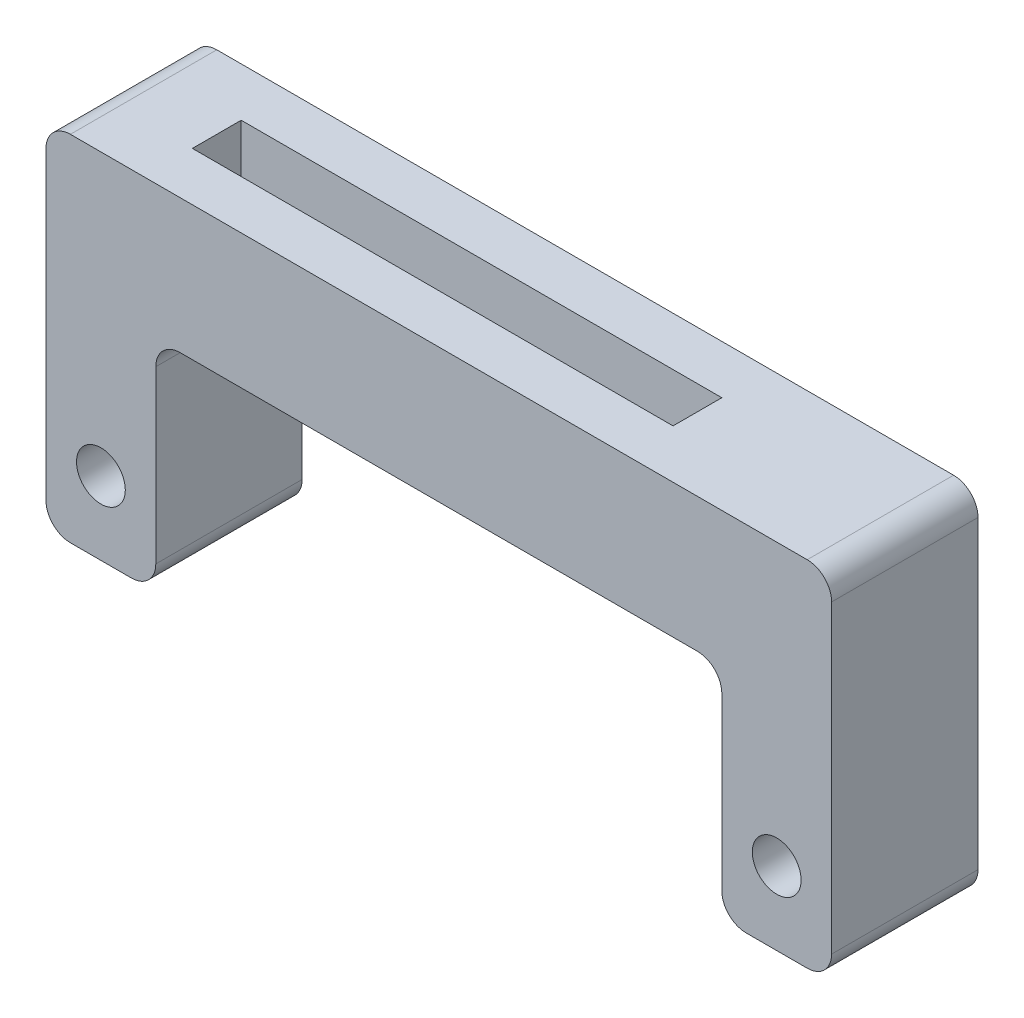
ISO-10303-21;
HEADER;
FILE_DESCRIPTION(('STEP AP214'),'2;1');
FILE_NAME('part.step','',(''),(''),'','','');
FILE_SCHEMA(('AUTOMOTIVE_DESIGN { 1 0 10303 214 1 1 1 1 }'));
ENDSEC;
DATA;
#1=APPLICATION_CONTEXT('core data for automotive mechanical design processes');
#2=APPLICATION_PROTOCOL_DEFINITION('international standard','automotive_design',2000,#1);
#3=PRODUCT_CONTEXT('',#1,'mechanical');
#4=PRODUCT('Part','Part','',(#3));
#5=PRODUCT_RELATED_PRODUCT_CATEGORY('part','',(#4));
#6=PRODUCT_DEFINITION_FORMATION('','',#4);
#7=PRODUCT_DEFINITION_CONTEXT('part definition',#1,'design');
#8=PRODUCT_DEFINITION('design','',#6,#7);
#9=PRODUCT_DEFINITION_SHAPE('','',#8);
#10=(LENGTH_UNIT() NAMED_UNIT(*) SI_UNIT(.MILLI.,.METRE.));
#11=(NAMED_UNIT(*) PLANE_ANGLE_UNIT() SI_UNIT($,.RADIAN.));
#12=(NAMED_UNIT(*) SI_UNIT($,.STERADIAN.) SOLID_ANGLE_UNIT());
#13=UNCERTAINTY_MEASURE_WITH_UNIT(LENGTH_MEASURE(1.E-05),#10,'distance_accuracy_value','');
#14=(GEOMETRIC_REPRESENTATION_CONTEXT(3) GLOBAL_UNCERTAINTY_ASSIGNED_CONTEXT((#13)) GLOBAL_UNIT_ASSIGNED_CONTEXT((#10,
#11,#12)) REPRESENTATION_CONTEXT('',''));
#15=CARTESIAN_POINT('',(0.,0.,0.));
#16=DIRECTION('',(0.,0.,1.));
#17=DIRECTION('',(1.,0.,0.));
#18=AXIS2_PLACEMENT_3D('',#15,#16,#17);
#19=CARTESIAN_POINT('',(-16.1,-7.25,3.));
#20=DIRECTION('',(0.,1.,0.));
#21=DIRECTION('',(0.,0.,1.));
#22=AXIS2_PLACEMENT_3D('',#19,#20,#21);
#23=PLANE('',#22);
#24=DIRECTION('',(1.,0.,0.));
#25=VECTOR('',#24,1.);
#26=CARTESIAN_POINT('',(-16.1,-7.25,-3.));
#27=LINE('',#26,#25);
#28=CARTESIAN_POINT('',(-15.1,-7.25,-3.));
#29=VERTEX_POINT('',#28);
#30=CARTESIAN_POINT('',(-12.6,-7.25,-3.));
#31=VERTEX_POINT('',#30);
#32=EDGE_CURVE('E244',#29,#31,#27,.T.);
#33=ORIENTED_EDGE('',*,*,#32,.T.);
#34=DIRECTION('',(0.,0.,1.));
#35=VECTOR('',#34,1.);
#36=CARTESIAN_POINT('',(-12.6,-7.25,3.));
#37=LINE('',#36,#35);
#38=CARTESIAN_POINT('',(-12.6,-7.25,3.));
#39=VERTEX_POINT('',#38);
#40=EDGE_CURVE('E349',#31,#39,#37,.T.);
#41=ORIENTED_EDGE('',*,*,#40,.T.);
#42=DIRECTION('',(1.,0.,0.));
#43=VECTOR('',#42,1.);
#44=CARTESIAN_POINT('',(-16.1,-7.25,3.));
#45=LINE('',#44,#43);
#46=CARTESIAN_POINT('',(-15.1,-7.25,3.));
#47=VERTEX_POINT('',#46);
#48=EDGE_CURVE('E254',#47,#39,#45,.T.);
#49=ORIENTED_EDGE('',*,*,#48,.F.);
#50=DIRECTION('',(0.,0.,-1.));
#51=VECTOR('',#50,1.);
#52=CARTESIAN_POINT('',(-15.1,-7.25,3.));
#53=LINE('',#52,#51);
#54=EDGE_CURVE('E345',#47,#29,#53,.T.);
#55=ORIENTED_EDGE('',*,*,#54,.T.);
#56=EDGE_LOOP('',(#33,#41,#49,#55));
#57=FACE_BOUND('',#56,.T.);
#58=ADVANCED_FACE('F41',(#57),#23,.F.);
#59=CARTESIAN_POINT('',(16.1,-7.25,3.));
#60=DIRECTION('',(-1.,0.,0.));
#61=DIRECTION('',(0.,0.,1.));
#62=AXIS2_PLACEMENT_3D('',#59,#60,#61);
#63=PLANE('',#62);
#64=DIRECTION('',(0.,1.,0.));
#65=VECTOR('',#64,1.);
#66=CARTESIAN_POINT('',(16.1,-7.25,-3.));
#67=LINE('',#66,#65);
#68=CARTESIAN_POINT('',(16.1,-6.25,-3.));
#69=VERTEX_POINT('',#68);
#70=CARTESIAN_POINT('',(16.1,6.25,-3.));
#71=VERTEX_POINT('',#70);
#72=EDGE_CURVE('E233',#69,#71,#67,.T.);
#73=ORIENTED_EDGE('',*,*,#72,.T.);
#74=DIRECTION('',(0.,0.,-1.));
#75=VECTOR('',#74,1.);
#76=CARTESIAN_POINT('',(16.1,6.25,3.));
#77=LINE('',#76,#75);
#78=CARTESIAN_POINT('',(16.1,6.25,3.));
#79=VERTEX_POINT('',#78);
#80=EDGE_CURVE('E298',#71,#79,#77,.F.);
#81=ORIENTED_EDGE('',*,*,#80,.T.);
#82=DIRECTION('',(0.,1.,0.));
#83=VECTOR('',#82,1.);
#84=CARTESIAN_POINT('',(16.1,-7.25,3.));
#85=LINE('',#84,#83);
#86=CARTESIAN_POINT('',(16.1,-6.25,3.));
#87=VERTEX_POINT('',#86);
#88=EDGE_CURVE('E239',#87,#79,#85,.T.);
#89=ORIENTED_EDGE('',*,*,#88,.F.);
#90=DIRECTION('',(0.,0.,-1.));
#91=VECTOR('',#90,1.);
#92=CARTESIAN_POINT('',(16.1,-6.25,3.));
#93=LINE('',#92,#91);
#94=EDGE_CURVE('E294',#87,#69,#93,.T.);
#95=ORIENTED_EDGE('',*,*,#94,.T.);
#96=EDGE_LOOP('',(#73,#81,#89,#95));
#97=FACE_BOUND('',#96,.T.);
#98=ADVANCED_FACE('F434',(#97),#63,.F.);
#99=CARTESIAN_POINT('',(-16.1,7.25,3.));
#100=DIRECTION('',(0.,-1.,0.));
#101=DIRECTION('',(0.,0.,-1.));
#102=AXIS2_PLACEMENT_3D('',#99,#100,#101);
#103=PLANE('',#102);
#104=DIRECTION('',(1.,0.,0.));
#105=VECTOR('',#104,1.);
#106=CARTESIAN_POINT('',(-12.1,7.25,1.));
#107=LINE('',#106,#105);
#108=CARTESIAN_POINT('',(-12.1,7.25,1.));
#109=VERTEX_POINT('',#108);
#110=CARTESIAN_POINT('',(7.6,7.25,1.));
#111=VERTEX_POINT('',#110);
#112=EDGE_CURVE('E223',#109,#111,#107,.T.);
#113=ORIENTED_EDGE('',*,*,#112,.F.);
#114=DIRECTION('',(0.,0.,1.));
#115=VECTOR('',#114,1.);
#116=CARTESIAN_POINT('',(-12.1,7.25,-1.));
#117=LINE('',#116,#115);
#118=CARTESIAN_POINT('',(-12.1,7.25,-1.));
#119=VERTEX_POINT('',#118);
#120=EDGE_CURVE('E187',#119,#109,#117,.T.);
#121=ORIENTED_EDGE('',*,*,#120,.F.);
#122=DIRECTION('',(-1.,0.,0.));
#123=VECTOR('',#122,1.);
#124=CARTESIAN_POINT('',(-12.1,7.25,-1.));
#125=LINE('',#124,#123);
#126=CARTESIAN_POINT('',(7.6,7.25,-1.));
#127=VERTEX_POINT('',#126);
#128=EDGE_CURVE('E207',#127,#119,#125,.T.);
#129=ORIENTED_EDGE('',*,*,#128,.F.);
#130=DIRECTION('',(0.,0.,-1.));
#131=VECTOR('',#130,1.);
#132=CARTESIAN_POINT('',(7.6,7.25,-1.));
#133=LINE('',#132,#131);
#134=EDGE_CURVE('E211',#111,#127,#133,.T.);
#135=ORIENTED_EDGE('',*,*,#134,.F.);
#136=EDGE_LOOP('',(#113,#121,#129,#135));
#137=FACE_BOUND('',#136,.T.);
#138=DIRECTION('',(-1.,0.,0.));
#139=VECTOR('',#138,1.);
#140=CARTESIAN_POINT('',(-16.1,7.25,3.));
#141=LINE('',#140,#139);
#142=CARTESIAN_POINT('',(15.1,7.25,3.));
#143=VERTEX_POINT('',#142);
#144=CARTESIAN_POINT('',(-15.1,7.25,3.));
#145=VERTEX_POINT('',#144);
#146=EDGE_CURVE('E243',#143,#145,#141,.T.);
#147=ORIENTED_EDGE('',*,*,#146,.F.);
#148=DIRECTION('',(0.,0.,-1.));
#149=VECTOR('',#148,1.);
#150=CARTESIAN_POINT('',(15.1,7.25,3.));
#151=LINE('',#150,#149);
#152=CARTESIAN_POINT('',(15.1,7.25,-3.));
#153=VERTEX_POINT('',#152);
#154=EDGE_CURVE('E272',#143,#153,#151,.T.);
#155=ORIENTED_EDGE('',*,*,#154,.T.);
#156=DIRECTION('',(-1.,0.,0.));
#157=VECTOR('',#156,1.);
#158=CARTESIAN_POINT('',(-16.1,7.25,-3.));
#159=LINE('',#158,#157);
#160=CARTESIAN_POINT('',(-15.1,7.25,-3.));
#161=VERTEX_POINT('',#160);
#162=EDGE_CURVE('E258',#153,#161,#159,.T.);
#163=ORIENTED_EDGE('',*,*,#162,.T.);
#164=DIRECTION('',(0.,0.,-1.));
#165=VECTOR('',#164,1.);
#166=CARTESIAN_POINT('',(-15.1,7.25,3.));
#167=LINE('',#166,#165);
#168=EDGE_CURVE('E269',#161,#145,#167,.F.);
#169=ORIENTED_EDGE('',*,*,#168,.T.);
#170=EDGE_LOOP('',(#147,#155,#163,#169));
#171=FACE_BOUND('',#170,.T.);
#172=ADVANCED_FACE('F442',(#137,#171),#103,.F.);
#173=CARTESIAN_POINT('',(-16.1,-7.25,3.));
#174=DIRECTION('',(1.,0.,0.));
#175=DIRECTION('',(0.,0.,-1.));
#176=AXIS2_PLACEMENT_3D('',#173,#174,#175);
#177=PLANE('',#176);
#178=DIRECTION('',(0.,-1.,0.));
#179=VECTOR('',#178,1.);
#180=CARTESIAN_POINT('',(-16.1,-7.25,-3.));
#181=LINE('',#180,#179);
#182=CARTESIAN_POINT('',(-16.1,6.25,-3.));
#183=VERTEX_POINT('',#182);
#184=CARTESIAN_POINT('',(-16.1,-6.25,-3.));
#185=VERTEX_POINT('',#184);
#186=EDGE_CURVE('E262',#183,#185,#181,.T.);
#187=ORIENTED_EDGE('',*,*,#186,.T.);
#188=DIRECTION('',(0.,0.,-1.));
#189=VECTOR('',#188,1.);
#190=CARTESIAN_POINT('',(-16.1,-6.25,3.));
#191=LINE('',#190,#189);
#192=CARTESIAN_POINT('',(-16.1,-6.25,3.));
#193=VERTEX_POINT('',#192);
#194=EDGE_CURVE('E57',#185,#193,#191,.F.);
#195=ORIENTED_EDGE('',*,*,#194,.T.);
#196=DIRECTION('',(0.,-1.,0.));
#197=VECTOR('',#196,1.);
#198=CARTESIAN_POINT('',(-16.1,-7.25,3.));
#199=LINE('',#198,#197);
#200=CARTESIAN_POINT('',(-16.1,6.25,3.));
#201=VERTEX_POINT('',#200);
#202=EDGE_CURVE('E247',#201,#193,#199,.T.);
#203=ORIENTED_EDGE('',*,*,#202,.F.);
#204=DIRECTION('',(0.,0.,-1.));
#205=VECTOR('',#204,1.);
#206=CARTESIAN_POINT('',(-16.1,6.25,3.));
#207=LINE('',#206,#205);
#208=EDGE_CURVE('E353',#201,#183,#207,.T.);
#209=ORIENTED_EDGE('',*,*,#208,.T.);
#210=EDGE_LOOP('',(#187,#195,#203,#209));
#211=FACE_BOUND('',#210,.T.);
#212=ADVANCED_FACE('F447',(#211),#177,.F.);
#213=CARTESIAN_POINT('',(12.6,-7.25,-3.));
#214=VERTEX_POINT('',#213);
#215=CARTESIAN_POINT('',(15.1,-7.25,-3.));
#216=VERTEX_POINT('',#215);
#217=EDGE_CURVE('E265',#214,#216,#27,.T.);
#218=ORIENTED_EDGE('',*,*,#217,.T.);
#219=DIRECTION('',(0.,0.,-1.));
#220=VECTOR('',#219,1.);
#221=CARTESIAN_POINT('',(15.1,-7.25,3.));
#222=LINE('',#221,#220);
#223=CARTESIAN_POINT('',(15.1,-7.25,3.));
#224=VERTEX_POINT('',#223);
#225=EDGE_CURVE('E321',#216,#224,#222,.F.);
#226=ORIENTED_EDGE('',*,*,#225,.T.);
#227=CARTESIAN_POINT('',(12.6,-7.25,3.));
#228=VERTEX_POINT('',#227);
#229=EDGE_CURVE('E250',#228,#224,#45,.T.);
#230=ORIENTED_EDGE('',*,*,#229,.F.);
#231=DIRECTION('',(0.,0.,1.));
#232=VECTOR('',#231,1.);
#233=CARTESIAN_POINT('',(12.6,-7.25,3.));
#234=LINE('',#233,#232);
#235=EDGE_CURVE('E318',#228,#214,#234,.F.);
#236=ORIENTED_EDGE('',*,*,#235,.T.);
#237=EDGE_LOOP('',(#218,#226,#230,#236));
#238=FACE_BOUND('',#237,.T.);
#239=ADVANCED_FACE('F426',(#238),#23,.F.);
#240=CARTESIAN_POINT('',(0.,0.,3.));
#241=DIRECTION('',(0.,0.,-1.));
#242=DIRECTION('',(-1.,0.,0.));
#243=AXIS2_PLACEMENT_3D('',#240,#241,#242);
#244=PLANE('',#243);
#245=CARTESIAN_POINT('',(-13.85,-4.25,3.));
#246=DIRECTION('',(0.,0.,1.));
#247=DIRECTION('',(1.,0.,0.));
#248=AXIS2_PLACEMENT_3D('',#245,#246,#247);
#249=CIRCLE('',#248,1.);
#250=CARTESIAN_POINT('',(-12.85,-4.25,3.));
#251=VERTEX_POINT('',#250);
#252=EDGE_CURVE('E679',#251,#251,#249,.T.);
#253=ORIENTED_EDGE('',*,*,#252,.F.);
#254=EDGE_LOOP('',(#253));
#255=FACE_BOUND('',#254,.T.);
#256=CARTESIAN_POINT('',(13.85,-4.25,3.));
#257=DIRECTION('',(0.,0.,1.));
#258=DIRECTION('',(1.,0.,0.));
#259=AXIS2_PLACEMENT_3D('',#256,#257,#258);
#260=CIRCLE('',#259,1.);
#261=CARTESIAN_POINT('',(14.85,-4.25,3.));
#262=VERTEX_POINT('',#261);
#263=EDGE_CURVE('E400',#262,#262,#260,.T.);
#264=ORIENTED_EDGE('',*,*,#263,.F.);
#265=EDGE_LOOP('',(#264));
#266=FACE_BOUND('',#265,.T.);
#267=ORIENTED_EDGE('',*,*,#88,.T.);
#268=CARTESIAN_POINT('',(15.1,6.25,3.));
#269=DIRECTION('',(0.,0.,-1.));
#270=DIRECTION('',(-1.,0.,0.));
#271=AXIS2_PLACEMENT_3D('',#268,#269,#270);
#272=CIRCLE('',#271,1.);
#273=EDGE_CURVE('E315',#79,#143,#272,.F.);
#274=ORIENTED_EDGE('',*,*,#273,.T.);
#275=ORIENTED_EDGE('',*,*,#146,.T.);
#276=CARTESIAN_POINT('',(-15.1,6.25,3.));
#277=DIRECTION('',(0.,0.,-1.));
#278=DIRECTION('',(-1.,0.,0.));
#279=AXIS2_PLACEMENT_3D('',#276,#277,#278);
#280=CIRCLE('',#279,1.);
#281=EDGE_CURVE('E64',#145,#201,#280,.F.);
#282=ORIENTED_EDGE('',*,*,#281,.T.);
#283=ORIENTED_EDGE('',*,*,#202,.T.);
#284=CARTESIAN_POINT('',(-15.1,-6.25,3.));
#285=DIRECTION('',(0.,0.,-1.));
#286=DIRECTION('',(-1.,0.,0.));
#287=AXIS2_PLACEMENT_3D('',#284,#285,#286);
#288=CIRCLE('',#287,1.);
#289=EDGE_CURVE('E303',#193,#47,#288,.F.);
#290=ORIENTED_EDGE('',*,*,#289,.T.);
#291=ORIENTED_EDGE('',*,*,#48,.T.);
#292=CARTESIAN_POINT('',(-12.6,-6.25,3.));
#293=DIRECTION('',(0.,0.,-1.));
#294=DIRECTION('',(-1.,0.,0.));
#295=AXIS2_PLACEMENT_3D('',#292,#293,#294);
#296=CIRCLE('',#295,1.);
#297=CARTESIAN_POINT('',(-11.6,-6.25,3.));
#298=VERTEX_POINT('',#297);
#299=EDGE_CURVE('E306',#39,#298,#296,.F.);
#300=ORIENTED_EDGE('',*,*,#299,.T.);
#301=DIRECTION('',(0.,-1.,0.));
#302=VECTOR('',#301,1.);
#303=CARTESIAN_POINT('',(-11.6,-7.25,3.));
#304=LINE('',#303,#302);
#305=CARTESIAN_POINT('',(-11.6,0.75,3.));
#306=VERTEX_POINT('',#305);
#307=EDGE_CURVE('E370',#306,#298,#304,.T.);
#308=ORIENTED_EDGE('',*,*,#307,.F.);
#309=CARTESIAN_POINT('',(-10.6,0.75,3.));
#310=DIRECTION('',(0.,0.,-1.));
#311=DIRECTION('',(-1.,0.,0.));
#312=AXIS2_PLACEMENT_3D('',#309,#310,#311);
#313=CIRCLE('',#312,1.);
#314=CARTESIAN_POINT('',(-10.6,1.75,3.));
#315=VERTEX_POINT('',#314);
#316=EDGE_CURVE('E50',#306,#315,#313,.T.);
#317=ORIENTED_EDGE('',*,*,#316,.T.);
#318=DIRECTION('',(-1.,0.,0.));
#319=VECTOR('',#318,1.);
#320=CARTESIAN_POINT('',(-11.6,1.75,3.));
#321=LINE('',#320,#319);
#322=CARTESIAN_POINT('',(10.6,1.75,3.));
#323=VERTEX_POINT('',#322);
#324=EDGE_CURVE('E214',#323,#315,#321,.T.);
#325=ORIENTED_EDGE('',*,*,#324,.F.);
#326=CARTESIAN_POINT('',(10.6,0.749999999999999,3.));
#327=DIRECTION('',(0.,0.,-1.));
#328=DIRECTION('',(-1.,0.,0.));
#329=AXIS2_PLACEMENT_3D('',#326,#327,#328);
#330=CIRCLE('',#329,1.);
#331=CARTESIAN_POINT('',(11.6,0.75,3.));
#332=VERTEX_POINT('',#331);
#333=EDGE_CURVE('E359',#323,#332,#330,.T.);
#334=ORIENTED_EDGE('',*,*,#333,.T.);
#335=DIRECTION('',(0.,1.,0.));
#336=VECTOR('',#335,1.);
#337=CARTESIAN_POINT('',(11.6,-7.25,3.));
#338=LINE('',#337,#336);
#339=CARTESIAN_POINT('',(11.6,-6.25,3.));
#340=VERTEX_POINT('',#339);
#341=EDGE_CURVE('E381',#340,#332,#338,.T.);
#342=ORIENTED_EDGE('',*,*,#341,.F.);
#343=CARTESIAN_POINT('',(12.6,-6.25,3.));
#344=DIRECTION('',(0.,0.,-1.));
#345=DIRECTION('',(-1.,0.,0.));
#346=AXIS2_PLACEMENT_3D('',#343,#344,#345);
#347=CIRCLE('',#346,1.);
#348=EDGE_CURVE('E309',#340,#228,#347,.F.);
#349=ORIENTED_EDGE('',*,*,#348,.T.);
#350=ORIENTED_EDGE('',*,*,#229,.T.);
#351=CARTESIAN_POINT('',(15.1,-6.25,3.));
#352=DIRECTION('',(0.,0.,-1.));
#353=DIRECTION('',(-1.,0.,0.));
#354=AXIS2_PLACEMENT_3D('',#351,#352,#353);
#355=CIRCLE('',#354,1.);
#356=EDGE_CURVE('E312',#224,#87,#355,.F.);
#357=ORIENTED_EDGE('',*,*,#356,.T.);
#358=EDGE_LOOP('',(#267,#274,#275,#282,#283,#290,#291,#300,#308,#317,#325,#334,#342,#349,#350,#357));
#359=FACE_BOUND('',#358,.T.);
#360=ADVANCED_FACE('F368',(#255,#266,#359),#244,.F.);
#361=CARTESIAN_POINT('',(0.,0.,-3.));
#362=DIRECTION('',(0.,0.,-1.));
#363=DIRECTION('',(-1.,0.,0.));
#364=AXIS2_PLACEMENT_3D('',#361,#362,#363);
#365=PLANE('',#364);
#366=CARTESIAN_POINT('',(-13.85,-4.25,-3.));
#367=DIRECTION('',(0.,0.,1.));
#368=DIRECTION('',(1.,0.,0.));
#369=AXIS2_PLACEMENT_3D('',#366,#367,#368);
#370=CIRCLE('',#369,1.);
#371=CARTESIAN_POINT('',(-12.85,-4.25,-3.));
#372=VERTEX_POINT('',#371);
#373=EDGE_CURVE('E406',#372,#372,#370,.T.);
#374=ORIENTED_EDGE('',*,*,#373,.T.);
#375=EDGE_LOOP('',(#374));
#376=FACE_BOUND('',#375,.T.);
#377=CARTESIAN_POINT('',(13.85,-4.25,-3.));
#378=DIRECTION('',(0.,0.,1.));
#379=DIRECTION('',(1.,0.,0.));
#380=AXIS2_PLACEMENT_3D('',#377,#378,#379);
#381=CIRCLE('',#380,1.);
#382=CARTESIAN_POINT('',(14.85,-4.25,-3.));
#383=VERTEX_POINT('',#382);
#384=EDGE_CURVE('E677',#383,#383,#381,.T.);
#385=ORIENTED_EDGE('',*,*,#384,.T.);
#386=EDGE_LOOP('',(#385));
#387=FACE_BOUND('',#386,.T.);
#388=ORIENTED_EDGE('',*,*,#162,.F.);
#389=CARTESIAN_POINT('',(15.1,6.25,-3.));
#390=DIRECTION('',(0.,0.,-1.));
#391=DIRECTION('',(-1.,0.,0.));
#392=AXIS2_PLACEMENT_3D('',#389,#390,#391);
#393=CIRCLE('',#392,1.);
#394=EDGE_CURVE('E291',#153,#71,#393,.T.);
#395=ORIENTED_EDGE('',*,*,#394,.T.);
#396=ORIENTED_EDGE('',*,*,#72,.F.);
#397=CARTESIAN_POINT('',(15.1,-6.25,-3.));
#398=DIRECTION('',(0.,0.,-1.));
#399=DIRECTION('',(-1.,0.,0.));
#400=AXIS2_PLACEMENT_3D('',#397,#398,#399);
#401=CIRCLE('',#400,1.);
#402=EDGE_CURVE('E288',#69,#216,#401,.T.);
#403=ORIENTED_EDGE('',*,*,#402,.T.);
#404=ORIENTED_EDGE('',*,*,#217,.F.);
#405=CARTESIAN_POINT('',(12.6,-6.25,-3.));
#406=DIRECTION('',(0.,0.,-1.));
#407=DIRECTION('',(-1.,0.,0.));
#408=AXIS2_PLACEMENT_3D('',#405,#406,#407);
#409=CIRCLE('',#408,1.);
#410=CARTESIAN_POINT('',(11.6,-6.25,-3.));
#411=VERTEX_POINT('',#410);
#412=EDGE_CURVE('E285',#214,#411,#409,.T.);
#413=ORIENTED_EDGE('',*,*,#412,.T.);
#414=DIRECTION('',(0.,1.,0.));
#415=VECTOR('',#414,1.);
#416=CARTESIAN_POINT('',(11.6,-7.25,-3.));
#417=LINE('',#416,#415);
#418=CARTESIAN_POINT('',(11.6,0.75,-3.));
#419=VERTEX_POINT('',#418);
#420=EDGE_CURVE('E394',#411,#419,#417,.T.);
#421=ORIENTED_EDGE('',*,*,#420,.T.);
#422=CARTESIAN_POINT('',(10.6,0.749999999999999,-3.));
#423=DIRECTION('',(0.,0.,-1.));
#424=DIRECTION('',(-1.,0.,0.));
#425=AXIS2_PLACEMENT_3D('',#422,#423,#424);
#426=CIRCLE('',#425,1.);
#427=CARTESIAN_POINT('',(10.6,1.75,-3.));
#428=VERTEX_POINT('',#427);
#429=EDGE_CURVE('E362',#419,#428,#426,.F.);
#430=ORIENTED_EDGE('',*,*,#429,.T.);
#431=DIRECTION('',(-1.,0.,0.));
#432=VECTOR('',#431,1.);
#433=CARTESIAN_POINT('',(-11.6,1.75,-3.));
#434=LINE('',#433,#432);
#435=CARTESIAN_POINT('',(-10.6,1.75,-3.));
#436=VERTEX_POINT('',#435);
#437=EDGE_CURVE('E224',#428,#436,#434,.T.);
#438=ORIENTED_EDGE('',*,*,#437,.T.);
#439=CARTESIAN_POINT('',(-10.6,0.75,-3.));
#440=DIRECTION('',(0.,0.,-1.));
#441=DIRECTION('',(-1.,0.,0.));
#442=AXIS2_PLACEMENT_3D('',#439,#440,#441);
#443=CIRCLE('',#442,1.);
#444=CARTESIAN_POINT('',(-11.6,0.75,-3.));
#445=VERTEX_POINT('',#444);
#446=EDGE_CURVE('E11',#436,#445,#443,.F.);
#447=ORIENTED_EDGE('',*,*,#446,.T.);
#448=DIRECTION('',(0.,-1.,0.));
#449=VECTOR('',#448,1.);
#450=CARTESIAN_POINT('',(-11.6,-7.25,-3.));
#451=LINE('',#450,#449);
#452=CARTESIAN_POINT('',(-11.6,-6.25,-3.));
#453=VERTEX_POINT('',#452);
#454=EDGE_CURVE('E380',#445,#453,#451,.T.);
#455=ORIENTED_EDGE('',*,*,#454,.T.);
#456=CARTESIAN_POINT('',(-12.6,-6.25,-3.));
#457=DIRECTION('',(0.,0.,-1.));
#458=DIRECTION('',(-1.,0.,0.));
#459=AXIS2_PLACEMENT_3D('',#456,#457,#458);
#460=CIRCLE('',#459,1.);
#461=EDGE_CURVE('E282',#453,#31,#460,.T.);
#462=ORIENTED_EDGE('',*,*,#461,.T.);
#463=ORIENTED_EDGE('',*,*,#32,.F.);
#464=CARTESIAN_POINT('',(-15.1,-6.25,-3.));
#465=DIRECTION('',(0.,0.,-1.));
#466=DIRECTION('',(-1.,0.,0.));
#467=AXIS2_PLACEMENT_3D('',#464,#465,#466);
#468=CIRCLE('',#467,1.);
#469=EDGE_CURVE('E279',#29,#185,#468,.T.);
#470=ORIENTED_EDGE('',*,*,#469,.T.);
#471=ORIENTED_EDGE('',*,*,#186,.F.);
#472=CARTESIAN_POINT('',(-15.1,6.25,-3.));
#473=DIRECTION('',(0.,0.,-1.));
#474=DIRECTION('',(-1.,0.,0.));
#475=AXIS2_PLACEMENT_3D('',#472,#473,#474);
#476=CIRCLE('',#475,1.);
#477=EDGE_CURVE('E276',#183,#161,#476,.T.);
#478=ORIENTED_EDGE('',*,*,#477,.T.);
#479=EDGE_LOOP('',(#388,#395,#396,#403,#404,#413,#421,#430,#438,#447,#455,#462,#463,#470,#471,#478));
#480=FACE_BOUND('',#479,.T.);
#481=ADVANCED_FACE('F388',(#376,#387,#480),#365,.T.);
#482=CARTESIAN_POINT('',(-12.1,4.75,-1.));
#483=DIRECTION('',(-1.,0.,0.));
#484=DIRECTION('',(0.,0.,1.));
#485=AXIS2_PLACEMENT_3D('',#482,#483,#484);
#486=PLANE('',#485);
#487=ORIENTED_EDGE('',*,*,#120,.T.);
#488=DIRECTION('',(0.,1.,0.));
#489=VECTOR('',#488,1.);
#490=CARTESIAN_POINT('',(-12.1,4.75,1.));
#491=LINE('',#490,#489);
#492=CARTESIAN_POINT('',(-12.1,4.75,1.));
#493=VERTEX_POINT('',#492);
#494=EDGE_CURVE('E180',#493,#109,#491,.T.);
#495=ORIENTED_EDGE('',*,*,#494,.F.);
#496=DIRECTION('',(0.,0.,1.));
#497=VECTOR('',#496,1.);
#498=CARTESIAN_POINT('',(-12.1,4.75,-1.));
#499=LINE('',#498,#497);
#500=CARTESIAN_POINT('',(-12.1,4.75,-1.));
#501=VERTEX_POINT('',#500);
#502=EDGE_CURVE('E184',#501,#493,#499,.T.);
#503=ORIENTED_EDGE('',*,*,#502,.F.);
#504=DIRECTION('',(0.,1.,0.));
#505=VECTOR('',#504,1.);
#506=CARTESIAN_POINT('',(-12.1,4.75,-1.));
#507=LINE('',#506,#505);
#508=EDGE_CURVE('E230',#501,#119,#507,.T.);
#509=ORIENTED_EDGE('',*,*,#508,.T.);
#510=EDGE_LOOP('',(#487,#495,#503,#509));
#511=FACE_BOUND('',#510,.T.);
#512=ADVANCED_FACE('F182',(#511),#486,.F.);
#513=CARTESIAN_POINT('',(-12.1,4.75,-1.));
#514=DIRECTION('',(0.,0.,-1.));
#515=DIRECTION('',(-1.,0.,0.));
#516=AXIS2_PLACEMENT_3D('',#513,#514,#515);
#517=PLANE('',#516);
#518=ORIENTED_EDGE('',*,*,#128,.T.);
#519=ORIENTED_EDGE('',*,*,#508,.F.);
#520=DIRECTION('',(-1.,0.,0.));
#521=VECTOR('',#520,1.);
#522=CARTESIAN_POINT('',(-12.1,4.75,-1.));
#523=LINE('',#522,#521);
#524=CARTESIAN_POINT('',(7.6,4.75,-1.));
#525=VERTEX_POINT('',#524);
#526=EDGE_CURVE('E193',#525,#501,#523,.T.);
#527=ORIENTED_EDGE('',*,*,#526,.F.);
#528=DIRECTION('',(0.,1.,0.));
#529=VECTOR('',#528,1.);
#530=CARTESIAN_POINT('',(7.6,4.75,-1.));
#531=LINE('',#530,#529);
#532=EDGE_CURVE('E234',#525,#127,#531,.T.);
#533=ORIENTED_EDGE('',*,*,#532,.T.);
#534=EDGE_LOOP('',(#518,#519,#527,#533));
#535=FACE_BOUND('',#534,.T.);
#536=ADVANCED_FACE('F608',(#535),#517,.F.);
#537=CARTESIAN_POINT('',(7.6,4.75,-1.));
#538=DIRECTION('',(1.,0.,0.));
#539=DIRECTION('',(0.,0.,-1.));
#540=AXIS2_PLACEMENT_3D('',#537,#538,#539);
#541=PLANE('',#540);
#542=ORIENTED_EDGE('',*,*,#134,.T.);
#543=ORIENTED_EDGE('',*,*,#532,.F.);
#544=DIRECTION('',(0.,0.,-1.));
#545=VECTOR('',#544,1.);
#546=CARTESIAN_POINT('',(7.6,4.75,-1.));
#547=LINE('',#546,#545);
#548=CARTESIAN_POINT('',(7.6,4.75,1.));
#549=VERTEX_POINT('',#548);
#550=EDGE_CURVE('E202',#549,#525,#547,.T.);
#551=ORIENTED_EDGE('',*,*,#550,.F.);
#552=DIRECTION('',(0.,1.,0.));
#553=VECTOR('',#552,1.);
#554=CARTESIAN_POINT('',(7.6,4.75,1.));
#555=LINE('',#554,#553);
#556=EDGE_CURVE('E192',#549,#111,#555,.T.);
#557=ORIENTED_EDGE('',*,*,#556,.T.);
#558=EDGE_LOOP('',(#542,#543,#551,#557));
#559=FACE_BOUND('',#558,.T.);
#560=ADVANCED_FACE('F600',(#559),#541,.F.);
#561=CARTESIAN_POINT('',(-12.1,4.75,1.));
#562=DIRECTION('',(0.,0.,1.));
#563=DIRECTION('',(1.,0.,0.));
#564=AXIS2_PLACEMENT_3D('',#561,#562,#563);
#565=PLANE('',#564);
#566=ORIENTED_EDGE('',*,*,#112,.T.);
#567=ORIENTED_EDGE('',*,*,#556,.F.);
#568=DIRECTION('',(1.,0.,0.));
#569=VECTOR('',#568,1.);
#570=CARTESIAN_POINT('',(-12.1,4.75,1.));
#571=LINE('',#570,#569);
#572=EDGE_CURVE('E196',#493,#549,#571,.T.);
#573=ORIENTED_EDGE('',*,*,#572,.F.);
#574=ORIENTED_EDGE('',*,*,#494,.T.);
#575=EDGE_LOOP('',(#566,#567,#573,#574));
#576=FACE_BOUND('',#575,.T.);
#577=ADVANCED_FACE('F197',(#576),#565,.F.);
#578=CARTESIAN_POINT('',(0.,4.75,0.));
#579=DIRECTION('',(0.,1.,0.));
#580=DIRECTION('',(0.,0.,1.));
#581=AXIS2_PLACEMENT_3D('',#578,#579,#580);
#582=PLANE('',#581);
#583=ORIENTED_EDGE('',*,*,#502,.T.);
#584=ORIENTED_EDGE('',*,*,#572,.T.);
#585=ORIENTED_EDGE('',*,*,#550,.T.);
#586=ORIENTED_EDGE('',*,*,#526,.T.);
#587=EDGE_LOOP('',(#583,#584,#585,#586));
#588=FACE_BOUND('',#587,.T.);
#589=ADVANCED_FACE('F204',(#588),#582,.T.);
#590=CARTESIAN_POINT('',(-11.6,-7.25,-3.));
#591=DIRECTION('',(-1.,0.,0.));
#592=DIRECTION('',(0.,0.,1.));
#593=AXIS2_PLACEMENT_3D('',#590,#591,#592);
#594=PLANE('',#593);
#595=ORIENTED_EDGE('',*,*,#454,.F.);
#596=DIRECTION('',(0.,0.,1.));
#597=VECTOR('',#596,1.);
#598=CARTESIAN_POINT('',(-11.6,0.75,3.));
#599=LINE('',#598,#597);
#600=EDGE_CURVE('E341',#445,#306,#599,.T.);
#601=ORIENTED_EDGE('',*,*,#600,.T.);
#602=ORIENTED_EDGE('',*,*,#307,.T.);
#603=DIRECTION('',(0.,0.,1.));
#604=VECTOR('',#603,1.);
#605=CARTESIAN_POINT('',(-11.6,-6.25,-3.));
#606=LINE('',#605,#604);
#607=EDGE_CURVE('E338',#298,#453,#606,.F.);
#608=ORIENTED_EDGE('',*,*,#607,.T.);
#609=EDGE_LOOP('',(#595,#601,#602,#608));
#610=FACE_BOUND('',#609,.T.);
#611=ADVANCED_FACE('F391',(#610),#594,.F.);
#612=CARTESIAN_POINT('',(-11.6,1.75,-3.));
#613=DIRECTION('',(0.,1.,0.));
#614=DIRECTION('',(0.,0.,1.));
#615=AXIS2_PLACEMENT_3D('',#612,#613,#614);
#616=PLANE('',#615);
#617=ORIENTED_EDGE('',*,*,#437,.F.);
#618=DIRECTION('',(0.,0.,1.));
#619=VECTOR('',#618,1.);
#620=CARTESIAN_POINT('',(10.6,1.75,3.));
#621=LINE('',#620,#619);
#622=EDGE_CURVE('E334',#428,#323,#621,.T.);
#623=ORIENTED_EDGE('',*,*,#622,.T.);
#624=ORIENTED_EDGE('',*,*,#324,.T.);
#625=DIRECTION('',(0.,0.,1.));
#626=VECTOR('',#625,1.);
#627=CARTESIAN_POINT('',(-10.6,1.75,-3.));
#628=LINE('',#627,#626);
#629=EDGE_CURVE('E331',#315,#436,#628,.F.);
#630=ORIENTED_EDGE('',*,*,#629,.T.);
#631=EDGE_LOOP('',(#617,#623,#624,#630));
#632=FACE_BOUND('',#631,.T.);
#633=ADVANCED_FACE('F376',(#632),#616,.F.);
#634=CARTESIAN_POINT('',(11.6,-7.25,-3.));
#635=DIRECTION('',(1.,0.,0.));
#636=DIRECTION('',(0.,0.,-1.));
#637=AXIS2_PLACEMENT_3D('',#634,#635,#636);
#638=PLANE('',#637);
#639=ORIENTED_EDGE('',*,*,#420,.F.);
#640=DIRECTION('',(0.,0.,1.));
#641=VECTOR('',#640,1.);
#642=CARTESIAN_POINT('',(11.6,-6.25,-3.));
#643=LINE('',#642,#641);
#644=EDGE_CURVE('E327',#411,#340,#643,.T.);
#645=ORIENTED_EDGE('',*,*,#644,.T.);
#646=ORIENTED_EDGE('',*,*,#341,.T.);
#647=DIRECTION('',(0.,0.,1.));
#648=VECTOR('',#647,1.);
#649=CARTESIAN_POINT('',(11.6,0.749999999999999,-3.));
#650=LINE('',#649,#648);
#651=EDGE_CURVE('E324',#332,#419,#650,.F.);
#652=ORIENTED_EDGE('',*,*,#651,.T.);
#653=EDGE_LOOP('',(#639,#645,#646,#652));
#654=FACE_BOUND('',#653,.T.);
#655=ADVANCED_FACE('F413',(#654),#638,.F.);
#656=CARTESIAN_POINT('',(13.85,-4.25,-3.));
#657=DIRECTION('',(0.,0.,1.));
#658=DIRECTION('',(1.,0.,0.));
#659=AXIS2_PLACEMENT_3D('',#656,#657,#658);
#660=CYLINDRICAL_SURFACE('',#659,1.);
#661=ORIENTED_EDGE('',*,*,#384,.F.);
#662=EDGE_LOOP('',(#661));
#663=FACE_BOUND('',#662,.T.);
#664=ORIENTED_EDGE('',*,*,#263,.T.);
#665=EDGE_LOOP('',(#664));
#666=FACE_BOUND('',#665,.T.);
#667=ADVANCED_FACE('F550',(#663,#666),#660,.F.);
#668=CARTESIAN_POINT('',(-13.85,-4.25,-3.));
#669=DIRECTION('',(0.,0.,1.));
#670=DIRECTION('',(1.,0.,0.));
#671=AXIS2_PLACEMENT_3D('',#668,#669,#670);
#672=CYLINDRICAL_SURFACE('',#671,1.);
#673=ORIENTED_EDGE('',*,*,#373,.F.);
#674=EDGE_LOOP('',(#673));
#675=FACE_BOUND('',#674,.T.);
#676=ORIENTED_EDGE('',*,*,#252,.T.);
#677=EDGE_LOOP('',(#676));
#678=FACE_BOUND('',#677,.T.);
#679=ADVANCED_FACE('F492',(#675,#678),#672,.F.);
#680=CARTESIAN_POINT('',(15.1,6.25,3.));
#681=DIRECTION('',(0.,0.,-1.));
#682=DIRECTION('',(-1.,0.,0.));
#683=AXIS2_PLACEMENT_3D('',#680,#681,#682);
#684=CYLINDRICAL_SURFACE('',#683,1.);
#685=ORIENTED_EDGE('',*,*,#273,.F.);
#686=ORIENTED_EDGE('',*,*,#80,.F.);
#687=ORIENTED_EDGE('',*,*,#394,.F.);
#688=ORIENTED_EDGE('',*,*,#154,.F.);
#689=EDGE_LOOP('',(#685,#686,#687,#688));
#690=FACE_BOUND('',#689,.T.);
#691=ADVANCED_FACE('F438',(#690),#684,.T.);
#692=CARTESIAN_POINT('',(15.1,-6.25,3.));
#693=DIRECTION('',(0.,0.,-1.));
#694=DIRECTION('',(-1.,0.,0.));
#695=AXIS2_PLACEMENT_3D('',#692,#693,#694);
#696=CYLINDRICAL_SURFACE('',#695,1.);
#697=ORIENTED_EDGE('',*,*,#356,.F.);
#698=ORIENTED_EDGE('',*,*,#225,.F.);
#699=ORIENTED_EDGE('',*,*,#402,.F.);
#700=ORIENTED_EDGE('',*,*,#94,.F.);
#701=EDGE_LOOP('',(#697,#698,#699,#700));
#702=FACE_BOUND('',#701,.T.);
#703=ADVANCED_FACE('F429',(#702),#696,.T.);
#704=CARTESIAN_POINT('',(12.6,-6.25,-3.));
#705=DIRECTION('',(0.,0.,1.));
#706=DIRECTION('',(1.,0.,0.));
#707=AXIS2_PLACEMENT_3D('',#704,#705,#706);
#708=CYLINDRICAL_SURFACE('',#707,1.);
#709=ORIENTED_EDGE('',*,*,#412,.F.);
#710=ORIENTED_EDGE('',*,*,#235,.F.);
#711=ORIENTED_EDGE('',*,*,#348,.F.);
#712=ORIENTED_EDGE('',*,*,#644,.F.);
#713=EDGE_LOOP('',(#709,#710,#711,#712));
#714=FACE_BOUND('',#713,.T.);
#715=ADVANCED_FACE('F421',(#714),#708,.T.);
#716=CARTESIAN_POINT('',(10.6,0.749999999999999,-3.));
#717=DIRECTION('',(0.,0.,-1.));
#718=DIRECTION('',(-1.,0.,0.));
#719=AXIS2_PLACEMENT_3D('',#716,#717,#718);
#720=CYLINDRICAL_SURFACE('',#719,1.);
#721=ORIENTED_EDGE('',*,*,#429,.F.);
#722=ORIENTED_EDGE('',*,*,#651,.F.);
#723=ORIENTED_EDGE('',*,*,#333,.F.);
#724=ORIENTED_EDGE('',*,*,#622,.F.);
#725=EDGE_LOOP('',(#721,#722,#723,#724));
#726=FACE_BOUND('',#725,.T.);
#727=ADVANCED_FACE('F417',(#726),#720,.F.);
#728=CARTESIAN_POINT('',(-10.6,0.75,-3.));
#729=DIRECTION('',(0.,0.,-1.));
#730=DIRECTION('',(-1.,0.,0.));
#731=AXIS2_PLACEMENT_3D('',#728,#729,#730);
#732=CYLINDRICAL_SURFACE('',#731,1.);
#733=ORIENTED_EDGE('',*,*,#446,.F.);
#734=ORIENTED_EDGE('',*,*,#629,.F.);
#735=ORIENTED_EDGE('',*,*,#316,.F.);
#736=ORIENTED_EDGE('',*,*,#600,.F.);
#737=EDGE_LOOP('',(#733,#734,#735,#736));
#738=FACE_BOUND('',#737,.T.);
#739=ADVANCED_FACE('F383',(#738),#732,.F.);
#740=CARTESIAN_POINT('',(-12.6,-6.25,3.));
#741=DIRECTION('',(0.,0.,1.));
#742=DIRECTION('',(1.,0.,0.));
#743=AXIS2_PLACEMENT_3D('',#740,#741,#742);
#744=CYLINDRICAL_SURFACE('',#743,1.);
#745=ORIENTED_EDGE('',*,*,#461,.F.);
#746=ORIENTED_EDGE('',*,*,#607,.F.);
#747=ORIENTED_EDGE('',*,*,#299,.F.);
#748=ORIENTED_EDGE('',*,*,#40,.F.);
#749=EDGE_LOOP('',(#745,#746,#747,#748));
#750=FACE_BOUND('',#749,.T.);
#751=ADVANCED_FACE('F461',(#750),#744,.T.);
#752=CARTESIAN_POINT('',(-15.1,-6.25,3.));
#753=DIRECTION('',(0.,0.,-1.));
#754=DIRECTION('',(-1.,0.,0.));
#755=AXIS2_PLACEMENT_3D('',#752,#753,#754);
#756=CYLINDRICAL_SURFACE('',#755,1.);
#757=ORIENTED_EDGE('',*,*,#289,.F.);
#758=ORIENTED_EDGE('',*,*,#194,.F.);
#759=ORIENTED_EDGE('',*,*,#469,.F.);
#760=ORIENTED_EDGE('',*,*,#54,.F.);
#761=EDGE_LOOP('',(#757,#758,#759,#760));
#762=FACE_BOUND('',#761,.T.);
#763=ADVANCED_FACE('F453',(#762),#756,.T.);
#764=CARTESIAN_POINT('',(-15.1,6.25,3.));
#765=DIRECTION('',(0.,0.,-1.));
#766=DIRECTION('',(-1.,0.,0.));
#767=AXIS2_PLACEMENT_3D('',#764,#765,#766);
#768=CYLINDRICAL_SURFACE('',#767,1.);
#769=ORIENTED_EDGE('',*,*,#281,.F.);
#770=ORIENTED_EDGE('',*,*,#168,.F.);
#771=ORIENTED_EDGE('',*,*,#477,.F.);
#772=ORIENTED_EDGE('',*,*,#208,.F.);
#773=EDGE_LOOP('',(#769,#770,#771,#772));
#774=FACE_BOUND('',#773,.T.);
#775=ADVANCED_FACE('F43',(#774),#768,.T.);
#776=CLOSED_SHELL('',(#58,#98,#172,#212,#239,#360,#481,#512,#536,#560,#577,#589,#611,#633,#655,
#667,#679,#691,#703,#715,#727,#739,#751,#763,#775));
#777=MANIFOLD_SOLID_BREP('B2',#776);
#778=ADVANCED_BREP_SHAPE_REPRESENTATION('',(#18,#777),#14);
#779=SHAPE_DEFINITION_REPRESENTATION(#9,#778);
ENDSEC;
END-ISO-10303-21;
